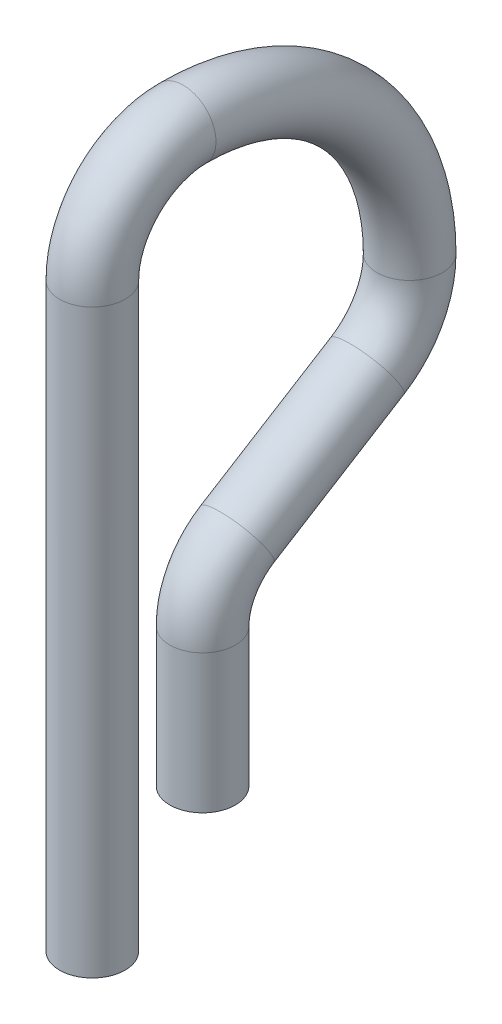
ISO-10303-21;
HEADER;
FILE_DESCRIPTION(('STEP AP214'),'2;1');
FILE_NAME('part.step','',(''),(''),'','','');
FILE_SCHEMA(('AUTOMOTIVE_DESIGN { 1 0 10303 214 1 1 1 1 }'));
ENDSEC;
DATA;
#1=APPLICATION_CONTEXT('core data for automotive mechanical design processes');
#2=APPLICATION_PROTOCOL_DEFINITION('international standard','automotive_design',2000,#1);
#3=PRODUCT_CONTEXT('',#1,'mechanical');
#4=PRODUCT('Part','Part','',(#3));
#5=PRODUCT_RELATED_PRODUCT_CATEGORY('part','',(#4));
#6=PRODUCT_DEFINITION_FORMATION('','',#4);
#7=PRODUCT_DEFINITION_CONTEXT('part definition',#1,'design');
#8=PRODUCT_DEFINITION('design','',#6,#7);
#9=PRODUCT_DEFINITION_SHAPE('','',#8);
#10=(LENGTH_UNIT() NAMED_UNIT(*) SI_UNIT(.MILLI.,.METRE.));
#11=(NAMED_UNIT(*) PLANE_ANGLE_UNIT() SI_UNIT($,.RADIAN.));
#12=(NAMED_UNIT(*) SI_UNIT($,.STERADIAN.) SOLID_ANGLE_UNIT());
#13=UNCERTAINTY_MEASURE_WITH_UNIT(LENGTH_MEASURE(1.E-05),#10,'distance_accuracy_value','');
#14=(GEOMETRIC_REPRESENTATION_CONTEXT(3) GLOBAL_UNCERTAINTY_ASSIGNED_CONTEXT((#13)) GLOBAL_UNIT_ASSIGNED_CONTEXT((#10,
#11,#12)) REPRESENTATION_CONTEXT('',''));
#15=CARTESIAN_POINT('',(0.,0.,0.));
#16=DIRECTION('',(0.,0.,1.));
#17=DIRECTION('',(1.,0.,0.));
#18=AXIS2_PLACEMENT_3D('',#15,#16,#17);
#19=CARTESIAN_POINT('',(0.,0.,0.));
#20=DIRECTION('',(0.,-1.,0.));
#21=DIRECTION('',(0.,0.,-1.));
#22=AXIS2_PLACEMENT_3D('',#19,#20,#21);
#23=PLANE('',#22);
#24=CARTESIAN_POINT('',(0.,0.,0.));
#25=DIRECTION('',(0.,-1.,0.));
#26=DIRECTION('',(0.,0.,-1.));
#27=AXIS2_PLACEMENT_3D('',#24,#25,#26);
#28=CIRCLE('',#27,5.588);
#29=CARTESIAN_POINT('',(0.,0.,-5.588));
#30=VERTEX_POINT('',#29);
#31=EDGE_CURVE('E81',#30,#30,#28,.T.);
#32=ORIENTED_EDGE('',*,*,#31,.T.);
#33=EDGE_LOOP('',(#32));
#34=FACE_BOUND('',#33,.T.);
#35=ADVANCED_FACE('F53',(#34),#23,.T.);
#36=CARTESIAN_POINT('',(0.,14.9860000000001,-18.796));
#37=DIRECTION('',(0.,1.,0.));
#38=DIRECTION('',(0.,0.,1.));
#39=AXIS2_PLACEMENT_3D('',#36,#37,#38);
#40=PLANE('',#39);
#41=CARTESIAN_POINT('',(0.,14.9860000000001,-18.796));
#42=DIRECTION('',(0.,1.,0.));
#43=DIRECTION('',(0.,0.,1.));
#44=AXIS2_PLACEMENT_3D('',#41,#42,#43);
#45=CIRCLE('',#44,5.588);
#46=CARTESIAN_POINT('',(0.,14.9860000000001,-13.208));
#47=VERTEX_POINT('',#46);
#48=EDGE_CURVE('E11',#47,#47,#45,.T.);
#49=ORIENTED_EDGE('',*,*,#48,.F.);
#50=EDGE_LOOP('',(#49));
#51=FACE_BOUND('',#50,.T.);
#52=ADVANCED_FACE('F89',(#51),#40,.F.);
#53=CARTESIAN_POINT('',(0.,0.,0.));
#54=DIRECTION('',(0.,1.,0.));
#55=DIRECTION('',(0.,0.,1.));
#56=AXIS2_PLACEMENT_3D('',#53,#54,#55);
#57=CYLINDRICAL_SURFACE('',#56,5.588);
#58=CARTESIAN_POINT('',(0.,99.06,0.));
#59=DIRECTION('',(0.,-1.,0.));
#60=DIRECTION('',(0.,0.,-1.));
#61=AXIS2_PLACEMENT_3D('',#58,#59,#60);
#62=CIRCLE('',#61,5.588);
#63=CARTESIAN_POINT('',(0.,99.06,5.588));
#64=VERTEX_POINT('',#63);
#65=EDGE_CURVE('E78',#64,#64,#62,.T.);
#66=ORIENTED_EDGE('',*,*,#65,.T.);
#67=EDGE_LOOP('',(#66));
#68=FACE_BOUND('',#67,.T.);
#69=ORIENTED_EDGE('',*,*,#31,.F.);
#70=EDGE_LOOP('',(#69));
#71=FACE_BOUND('',#70,.T.);
#72=ADVANCED_FACE('F86',(#68,#71),#57,.T.);
#73=CARTESIAN_POINT('',(0.,99.06,-15.494));
#74=DIRECTION('',(-1.,0.,0.));
#75=DIRECTION('',(0.,0.,1.));
#76=AXIS2_PLACEMENT_3D('',#73,#74,#75);
#77=TOROIDAL_SURFACE('',#76,15.494,5.588);
#78=CARTESIAN_POINT('',(0.,114.554,-15.494));
#79=DIRECTION('',(0.,0.,1.));
#80=DIRECTION('',(0.,-1.,0.));
#81=AXIS2_PLACEMENT_3D('',#78,#79,#80);
#82=CIRCLE('',#81,5.588);
#83=CARTESIAN_POINT('',(0.,120.142,-15.494));
#84=VERTEX_POINT('',#83);
#85=EDGE_CURVE('E75',#84,#84,#82,.T.);
#86=CARTESIAN_POINT('',(0.,99.06,-15.494));
#87=DIRECTION('',(-1.,0.,0.));
#88=DIRECTION('',(0.,0.,1.));
#89=AXIS2_PLACEMENT_3D('',#86,#87,#88);
#90=CIRCLE('',#89,21.082);
#91=EDGE_CURVE('',#64,#84,#90,.T.);
#92=ORIENTED_EDGE('',*,*,#65,.F.);
#93=ORIENTED_EDGE('',*,*,#85,.T.);
#94=ORIENTED_EDGE('',*,*,#91,.T.);
#95=ORIENTED_EDGE('',*,*,#91,.F.);
#96=EDGE_LOOP('',(#92,#94,#93,#95));
#97=FACE_BOUND('',#96,.T.);
#98=ADVANCED_FACE('F88',(#97),#77,.T.);
#99=CARTESIAN_POINT('',(0.,75.946,-15.494));
#100=DIRECTION('',(-1.,0.,0.));
#101=DIRECTION('',(0.,0.,1.));
#102=AXIS2_PLACEMENT_3D('',#99,#100,#101);
#103=TOROIDAL_SURFACE('',#102,38.608,5.588);
#104=CARTESIAN_POINT('',(0.,75.946,-54.102));
#105=DIRECTION('',(0.,1.,0.));
#106=DIRECTION('',(0.,0.,1.));
#107=AXIS2_PLACEMENT_3D('',#104,#105,#106);
#108=CIRCLE('',#107,5.588);
#109=CARTESIAN_POINT('',(0.,75.946,-59.69));
#110=VERTEX_POINT('',#109);
#111=EDGE_CURVE('E72',#110,#110,#108,.T.);
#112=CARTESIAN_POINT('',(0.,75.946,-15.494));
#113=DIRECTION('',(-1.,0.,0.));
#114=DIRECTION('',(0.,0.,1.));
#115=AXIS2_PLACEMENT_3D('',#112,#113,#114);
#116=CIRCLE('',#115,44.196);
#117=EDGE_CURVE('',#84,#110,#116,.T.);
#118=ORIENTED_EDGE('',*,*,#85,.F.);
#119=ORIENTED_EDGE('',*,*,#111,.T.);
#120=ORIENTED_EDGE('',*,*,#117,.T.);
#121=ORIENTED_EDGE('',*,*,#117,.F.);
#122=EDGE_LOOP('',(#118,#120,#119,#121));
#123=FACE_BOUND('',#122,.T.);
#124=ADVANCED_FACE('F96',(#123),#103,.T.);
#125=CARTESIAN_POINT('',(0.,75.946,-38.862));
#126=DIRECTION('',(-1.,0.,0.));
#127=DIRECTION('',(0.,0.,1.));
#128=AXIS2_PLACEMENT_3D('',#125,#126,#127);
#129=TOROIDAL_SURFACE('',#128,15.24,5.588);
#130=CARTESIAN_POINT('',(0.,62.992,-46.8901681596738));
#131=DIRECTION('',(0.,0.526782687642636,-0.850000000000001));
#132=DIRECTION('',(0.,0.850000000000001,0.526782687642636));
#133=AXIS2_PLACEMENT_3D('',#130,#131,#132);
#134=CIRCLE('',#133,5.588);
#135=CARTESIAN_POINT('',(0.,58.2422,-49.8338298182208));
#136=VERTEX_POINT('',#135);
#137=EDGE_CURVE('E67',#136,#136,#134,.T.);
#138=CARTESIAN_POINT('',(0.,75.946,-38.862));
#139=DIRECTION('',(-1.,0.,0.));
#140=DIRECTION('',(0.,0.,1.));
#141=AXIS2_PLACEMENT_3D('',#138,#139,#140);
#142=CIRCLE('',#141,20.828);
#143=EDGE_CURVE('',#110,#136,#142,.T.);
#144=ORIENTED_EDGE('',*,*,#111,.F.);
#145=ORIENTED_EDGE('',*,*,#137,.T.);
#146=ORIENTED_EDGE('',*,*,#143,.T.);
#147=ORIENTED_EDGE('',*,*,#143,.F.);
#148=EDGE_LOOP('',(#144,#146,#145,#147));
#149=FACE_BOUND('',#148,.T.);
#150=ADVANCED_FACE('F113',(#149),#129,.T.);
#151=CARTESIAN_POINT('',(0.,62.992,-46.8901681596738));
#152=DIRECTION('',(0.,-0.526782687642636,0.850000000000001));
#153=DIRECTION('',(0.,-0.850000000000001,-0.526782687642636));
#154=AXIS2_PLACEMENT_3D('',#151,#152,#153);
#155=CYLINDRICAL_SURFACE('',#154,5.588);
#156=CARTESIAN_POINT('',(0.,49.2539477913057,-24.722878589763));
#157=DIRECTION('',(0.,0.526782687642636,-0.850000000000001));
#158=DIRECTION('',(0.,0.850000000000001,0.526782687642636));
#159=AXIS2_PLACEMENT_3D('',#156,#157,#158);
#160=CIRCLE('',#159,5.588);
#161=CARTESIAN_POINT('',(0.,54.0037477913057,-21.7792169312159));
#162=VERTEX_POINT('',#161);
#163=EDGE_CURVE('E63',#162,#162,#160,.T.);
#164=ORIENTED_EDGE('',*,*,#163,.T.);
#165=EDGE_LOOP('',(#164));
#166=FACE_BOUND('',#165,.T.);
#167=ORIENTED_EDGE('',*,*,#137,.F.);
#168=EDGE_LOOP('',(#167));
#169=FACE_BOUND('',#168,.T.);
#170=ADVANCED_FACE('F107',(#166,#169),#155,.T.);
#171=CARTESIAN_POINT('',(0.,38.6079999999999,-31.3206444603597));
#172=DIRECTION('',(1.,0.,0.));
#173=DIRECTION('',(0.,0.,-1.));
#174=AXIS2_PLACEMENT_3D('',#171,#172,#173);
#175=TOROIDAL_SURFACE('',#174,12.5246444603597,5.588);
#176=CARTESIAN_POINT('',(0.,38.6079999999999,-18.796));
#177=DIRECTION('',(0.,1.,0.));
#178=DIRECTION('',(0.,0.,1.));
#179=AXIS2_PLACEMENT_3D('',#176,#177,#178);
#180=CIRCLE('',#179,5.588);
#181=CARTESIAN_POINT('',(0.,38.6079999999999,-13.208));
#182=VERTEX_POINT('',#181);
#183=EDGE_CURVE('E59',#182,#182,#180,.T.);
#184=CARTESIAN_POINT('',(0.,38.6079999999999,-31.3206444603597));
#185=DIRECTION('',(1.,0.,0.));
#186=DIRECTION('',(0.,0.,-1.));
#187=AXIS2_PLACEMENT_3D('',#184,#185,#186);
#188=CIRCLE('',#187,18.1126444603597);
#189=EDGE_CURVE('',#162,#182,#188,.T.);
#190=ORIENTED_EDGE('',*,*,#163,.F.);
#191=ORIENTED_EDGE('',*,*,#183,.T.);
#192=ORIENTED_EDGE('',*,*,#189,.T.);
#193=ORIENTED_EDGE('',*,*,#189,.F.);
#194=EDGE_LOOP('',(#190,#192,#191,#193));
#195=FACE_BOUND('',#194,.T.);
#196=ADVANCED_FACE('F102',(#195),#175,.T.);
#197=CARTESIAN_POINT('',(0.,38.6079999999999,-18.796));
#198=DIRECTION('',(0.,-1.,0.));
#199=DIRECTION('',(0.,0.,-1.));
#200=AXIS2_PLACEMENT_3D('',#197,#198,#199);
#201=CYLINDRICAL_SURFACE('',#200,5.588);
#202=ORIENTED_EDGE('',*,*,#48,.T.);
#203=EDGE_LOOP('',(#202));
#204=FACE_BOUND('',#203,.T.);
#205=ORIENTED_EDGE('',*,*,#183,.F.);
#206=EDGE_LOOP('',(#205));
#207=FACE_BOUND('',#206,.T.);
#208=ADVANCED_FACE('F100',(#204,#207),#201,.T.);
#209=CLOSED_SHELL('',(#35,#52,#72,#98,#124,#150,#170,#196,#208));
#210=MANIFOLD_SOLID_BREP('B2',#209);
#211=ADVANCED_BREP_SHAPE_REPRESENTATION('',(#18,#210),#14);
#212=SHAPE_DEFINITION_REPRESENTATION(#9,#211);
ENDSEC;
END-ISO-10303-21;
